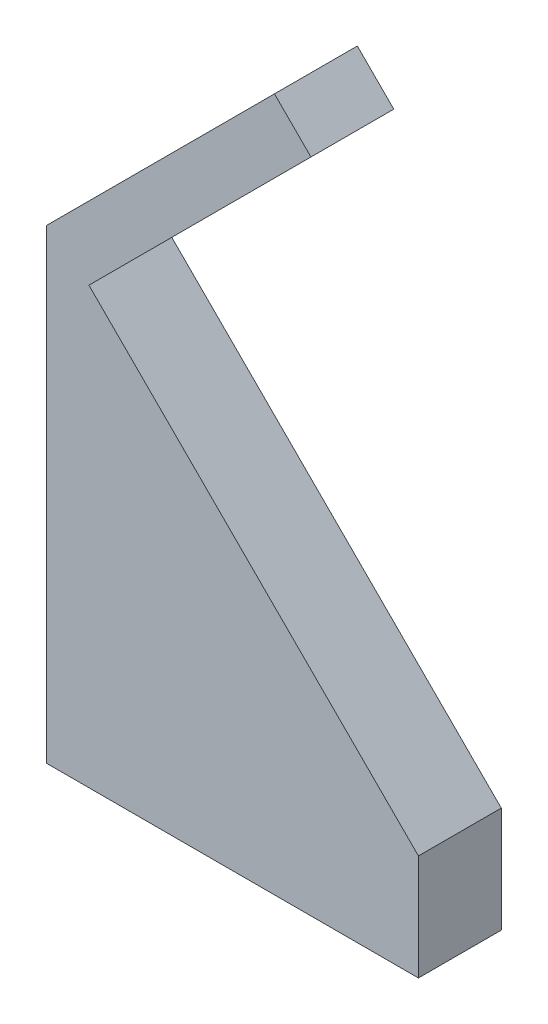
ISO-10303-21;
HEADER;
FILE_DESCRIPTION(('STEP AP214'),'2;1');
FILE_NAME('part.step','',(''),(''),'','','');
FILE_SCHEMA(('AUTOMOTIVE_DESIGN { 1 0 10303 214 1 1 1 1 }'));
ENDSEC;
DATA;
#1=APPLICATION_CONTEXT('core data for automotive mechanical design processes');
#2=APPLICATION_PROTOCOL_DEFINITION('international standard','automotive_design',2000,#1);
#3=PRODUCT_CONTEXT('',#1,'mechanical');
#4=PRODUCT('Part','Part','',(#3));
#5=PRODUCT_RELATED_PRODUCT_CATEGORY('part','',(#4));
#6=PRODUCT_DEFINITION_FORMATION('','',#4);
#7=PRODUCT_DEFINITION_CONTEXT('part definition',#1,'design');
#8=PRODUCT_DEFINITION('design','',#6,#7);
#9=PRODUCT_DEFINITION_SHAPE('','',#8);
#10=(LENGTH_UNIT() NAMED_UNIT(*) SI_UNIT(.MILLI.,.METRE.));
#11=(NAMED_UNIT(*) PLANE_ANGLE_UNIT() SI_UNIT($,.RADIAN.));
#12=(NAMED_UNIT(*) SI_UNIT($,.STERADIAN.) SOLID_ANGLE_UNIT());
#13=UNCERTAINTY_MEASURE_WITH_UNIT(LENGTH_MEASURE(1.E-05),#10,'distance_accuracy_value','');
#14=(GEOMETRIC_REPRESENTATION_CONTEXT(3) GLOBAL_UNCERTAINTY_ASSIGNED_CONTEXT((#13)) GLOBAL_UNIT_ASSIGNED_CONTEXT((#10,
#11,#12)) REPRESENTATION_CONTEXT('',''));
#15=CARTESIAN_POINT('',(0.,0.,0.));
#16=DIRECTION('',(0.,0.,1.));
#17=DIRECTION('',(1.,0.,0.));
#18=AXIS2_PLACEMENT_3D('',#15,#16,#17);
#19=CARTESIAN_POINT('',(-40.8946983434708,-5.00136204208354,8.));
#20=DIRECTION('',(1.,0.,0.));
#21=DIRECTION('',(0.,1.,0.));
#22=AXIS2_PLACEMENT_3D('',#19,#20,#21);
#23=PLANE('',#22);
#24=DIRECTION('',(0.,-1.,0.));
#25=VECTOR('',#24,1.);
#26=CARTESIAN_POINT('',(-40.8946983434708,-5.00136204208354,0.));
#27=LINE('',#26,#25);
#28=CARTESIAN_POINT('',(-40.8946983434708,-5.00136204208354,0.));
#29=VERTEX_POINT('',#28);
#30=CARTESIAN_POINT('',(-40.8946983434707,-50.,0.));
#31=VERTEX_POINT('',#30);
#32=EDGE_CURVE('E123',#29,#31,#27,.T.);
#33=ORIENTED_EDGE('',*,*,#32,.T.);
#34=DIRECTION('',(0.,0.,-1.));
#35=VECTOR('',#34,1.);
#36=CARTESIAN_POINT('',(-40.8946983434707,-50.,8.));
#37=LINE('',#36,#35);
#38=CARTESIAN_POINT('',(-40.8946983434707,-50.,8.));
#39=VERTEX_POINT('',#38);
#40=EDGE_CURVE('E11',#39,#31,#37,.T.);
#41=ORIENTED_EDGE('',*,*,#40,.F.);
#42=DIRECTION('',(0.,-1.,0.));
#43=VECTOR('',#42,1.);
#44=CARTESIAN_POINT('',(-40.8946983434708,-5.00136204208354,8.));
#45=LINE('',#44,#43);
#46=CARTESIAN_POINT('',(-40.8946983434708,-5.00136204208354,8.));
#47=VERTEX_POINT('',#46);
#48=EDGE_CURVE('E135',#47,#39,#45,.T.);
#49=ORIENTED_EDGE('',*,*,#48,.F.);
#50=DIRECTION('',(0.,0.,-1.));
#51=VECTOR('',#50,1.);
#52=CARTESIAN_POINT('',(-40.8946983434708,-5.00136204208354,8.));
#53=LINE('',#52,#51);
#54=EDGE_CURVE('E119',#47,#29,#53,.T.);
#55=ORIENTED_EDGE('',*,*,#54,.T.);
#56=EDGE_LOOP('',(#33,#41,#49,#55));
#57=FACE_BOUND('',#56,.T.);
#58=ADVANCED_FACE('F33',(#57),#23,.F.);
#59=CARTESIAN_POINT('',(-4.99999999999956,-50.,8.));
#60=DIRECTION('',(0.,1.,0.));
#61=DIRECTION('',(-1.,0.,0.));
#62=AXIS2_PLACEMENT_3D('',#59,#60,#61);
#63=PLANE('',#62);
#64=DIRECTION('',(1.,0.,0.));
#65=VECTOR('',#64,1.);
#66=CARTESIAN_POINT('',(-4.99999999999956,-50.,0.));
#67=LINE('',#66,#65);
#68=CARTESIAN_POINT('',(-4.99999999999956,-50.,0.));
#69=VERTEX_POINT('',#68);
#70=EDGE_CURVE('E126',#31,#69,#67,.T.);
#71=ORIENTED_EDGE('',*,*,#70,.T.);
#72=DIRECTION('',(0.,0.,-1.));
#73=VECTOR('',#72,1.);
#74=CARTESIAN_POINT('',(-4.99999999999956,-50.,8.));
#75=LINE('',#74,#73);
#76=CARTESIAN_POINT('',(-4.99999999999956,-50.,8.));
#77=VERTEX_POINT('',#76);
#78=EDGE_CURVE('E41',#77,#69,#75,.T.);
#79=ORIENTED_EDGE('',*,*,#78,.F.);
#80=DIRECTION('',(1.,0.,0.));
#81=VECTOR('',#80,1.);
#82=CARTESIAN_POINT('',(-4.99999999999956,-50.,8.));
#83=LINE('',#82,#81);
#84=EDGE_CURVE('E89',#39,#77,#83,.T.);
#85=ORIENTED_EDGE('',*,*,#84,.F.);
#86=ORIENTED_EDGE('',*,*,#40,.T.);
#87=EDGE_LOOP('',(#71,#79,#85,#86));
#88=FACE_BOUND('',#87,.T.);
#89=ADVANCED_FACE('F160',(#88),#63,.F.);
#90=CARTESIAN_POINT('',(-4.99999999999999,-39.7901994577491,8.));
#91=DIRECTION('',(-1.,0.,0.));
#92=DIRECTION('',(0.,-1.,0.));
#93=AXIS2_PLACEMENT_3D('',#90,#91,#92);
#94=PLANE('',#93);
#95=DIRECTION('',(0.,1.,0.));
#96=VECTOR('',#95,1.);
#97=CARTESIAN_POINT('',(-4.99999999999999,-39.7901994577491,0.));
#98=LINE('',#97,#96);
#99=CARTESIAN_POINT('',(-4.99999999999999,-39.7901994577491,0.));
#100=VERTEX_POINT('',#99);
#101=EDGE_CURVE('E128',#69,#100,#98,.T.);
#102=ORIENTED_EDGE('',*,*,#101,.T.);
#103=DIRECTION('',(0.,0.,-1.));
#104=VECTOR('',#103,1.);
#105=CARTESIAN_POINT('',(-4.99999999999999,-39.7901994577491,8.));
#106=LINE('',#105,#104);
#107=CARTESIAN_POINT('',(-4.99999999999999,-39.7901994577491,8.));
#108=VERTEX_POINT('',#107);
#109=EDGE_CURVE('E139',#108,#100,#106,.T.);
#110=ORIENTED_EDGE('',*,*,#109,.F.);
#111=DIRECTION('',(0.,1.,0.));
#112=VECTOR('',#111,1.);
#113=CARTESIAN_POINT('',(-4.99999999999999,-39.7901994577491,8.));
#114=LINE('',#113,#112);
#115=EDGE_CURVE('E147',#77,#108,#114,.T.);
#116=ORIENTED_EDGE('',*,*,#115,.F.);
#117=ORIENTED_EDGE('',*,*,#78,.T.);
#118=EDGE_LOOP('',(#102,#110,#116,#117));
#119=FACE_BOUND('',#118,.T.);
#120=ADVANCED_FACE('F145',(#119),#94,.F.);
#121=CARTESIAN_POINT('',(-4.99999999999999,-39.7901994577491,8.));
#122=DIRECTION('',(-0.707106781186552,-0.707106781186543,0.));
#123=DIRECTION('',(0.707106781186543,-0.707106781186552,0.));
#124=AXIS2_PLACEMENT_3D('',#121,#122,#123);
#125=PLANE('',#124);
#126=DIRECTION('',(-0.707106781186542,0.707106781186552,0.));
#127=VECTOR('',#126,1.);
#128=CARTESIAN_POINT('',(-4.99999999999999,-39.7901994577491,0.));
#129=LINE('',#128,#127);
#130=CARTESIAN_POINT('',(-36.8198051533944,-7.97039430435419,0.));
#131=VERTEX_POINT('',#130);
#132=EDGE_CURVE('E130',#100,#131,#129,.T.);
#133=ORIENTED_EDGE('',*,*,#132,.T.);
#134=DIRECTION('',(0.,0.,-1.));
#135=VECTOR('',#134,1.);
#136=CARTESIAN_POINT('',(-36.8198051533944,-7.97039430435419,8.));
#137=LINE('',#136,#135);
#138=CARTESIAN_POINT('',(-36.8198051533944,-7.97039430435419,8.));
#139=VERTEX_POINT('',#138);
#140=EDGE_CURVE('E114',#139,#131,#137,.T.);
#141=ORIENTED_EDGE('',*,*,#140,.F.);
#142=DIRECTION('',(-0.707106781186542,0.707106781186552,0.));
#143=VECTOR('',#142,1.);
#144=CARTESIAN_POINT('',(-4.99999999999999,-39.7901994577491,8.));
#145=LINE('',#144,#143);
#146=EDGE_CURVE('E105',#108,#139,#145,.T.);
#147=ORIENTED_EDGE('',*,*,#146,.F.);
#148=ORIENTED_EDGE('',*,*,#109,.T.);
#149=EDGE_LOOP('',(#133,#141,#147,#148));
#150=FACE_BOUND('',#149,.T.);
#151=ADVANCED_FACE('F153',(#150),#125,.F.);
#152=CARTESIAN_POINT('',(-36.8198051533944,-7.97039430435419,8.));
#153=DIRECTION('',(-0.707106781186543,0.707106781186553,0.));
#154=DIRECTION('',(-0.707106781186553,-0.707106781186542,0.));
#155=AXIS2_PLACEMENT_3D('',#152,#153,#154);
#156=PLANE('',#155);
#157=DIRECTION('',(0.707106781186552,0.707106781186542,0.));
#158=VECTOR('',#157,1.);
#159=CARTESIAN_POINT('',(-36.8198051533944,-7.97039430435419,0.));
#160=LINE('',#159,#158);
#161=CARTESIAN_POINT('',(-15.3793160616113,13.4700947874286,0.));
#162=VERTEX_POINT('',#161);
#163=EDGE_CURVE('E113',#131,#162,#160,.T.);
#164=ORIENTED_EDGE('',*,*,#163,.T.);
#165=DIRECTION('',(0.,0.,-1.));
#166=VECTOR('',#165,1.);
#167=CARTESIAN_POINT('',(-15.3793160616113,13.4700947874286,8.));
#168=LINE('',#167,#166);
#169=CARTESIAN_POINT('',(-15.3793160616113,13.4700947874286,8.));
#170=VERTEX_POINT('',#169);
#171=EDGE_CURVE('E110',#170,#162,#168,.T.);
#172=ORIENTED_EDGE('',*,*,#171,.F.);
#173=DIRECTION('',(0.707106781186552,0.707106781186542,0.));
#174=VECTOR('',#173,1.);
#175=CARTESIAN_POINT('',(-36.8198051533944,-7.97039430435419,8.));
#176=LINE('',#175,#174);
#177=EDGE_CURVE('E99',#139,#170,#176,.T.);
#178=ORIENTED_EDGE('',*,*,#177,.F.);
#179=ORIENTED_EDGE('',*,*,#140,.T.);
#180=EDGE_LOOP('',(#164,#172,#178,#179));
#181=FACE_BOUND('',#180,.T.);
#182=ADVANCED_FACE('F111',(#181),#156,.F.);
#183=CARTESIAN_POINT('',(-15.3793160616113,13.4700947874286,8.));
#184=DIRECTION('',(-0.707106781186552,-0.707106781186543,0.));
#185=DIRECTION('',(0.707106781186543,-0.707106781186552,0.));
#186=AXIS2_PLACEMENT_3D('',#183,#184,#185);
#187=PLANE('',#186);
#188=DIRECTION('',(-0.707106781186543,0.707106781186552,0.));
#189=VECTOR('',#188,1.);
#190=CARTESIAN_POINT('',(-15.3793160616113,13.4700947874286,0.));
#191=LINE('',#190,#189);
#192=CARTESIAN_POINT('',(-18.9012787877849,16.9920575136021,0.));
#193=VERTEX_POINT('',#192);
#194=EDGE_CURVE('E75',#162,#193,#191,.T.);
#195=ORIENTED_EDGE('',*,*,#194,.T.);
#196=DIRECTION('',(0.,0.,-1.));
#197=VECTOR('',#196,1.);
#198=CARTESIAN_POINT('',(-18.9012787877849,16.9920575136021,8.));
#199=LINE('',#198,#197);
#200=CARTESIAN_POINT('',(-18.9012787877849,16.9920575136021,8.));
#201=VERTEX_POINT('',#200);
#202=EDGE_CURVE('E115',#201,#193,#199,.T.);
#203=ORIENTED_EDGE('',*,*,#202,.F.);
#204=DIRECTION('',(-0.707106781186543,0.707106781186552,0.));
#205=VECTOR('',#204,1.);
#206=CARTESIAN_POINT('',(-15.3793160616113,13.4700947874286,8.));
#207=LINE('',#206,#205);
#208=EDGE_CURVE('E103',#170,#201,#207,.T.);
#209=ORIENTED_EDGE('',*,*,#208,.F.);
#210=ORIENTED_EDGE('',*,*,#171,.T.);
#211=EDGE_LOOP('',(#195,#203,#209,#210));
#212=FACE_BOUND('',#211,.T.);
#213=ADVANCED_FACE('F117',(#212),#187,.F.);
#214=CARTESIAN_POINT('',(-18.9012787877849,16.9920575136021,8.));
#215=DIRECTION('',(0.707106781186543,-0.707106781186552,0.));
#216=DIRECTION('',(0.707106781186552,0.707106781186543,0.));
#217=AXIS2_PLACEMENT_3D('',#214,#215,#216);
#218=PLANE('',#217);
#219=DIRECTION('',(-0.707106781186552,-0.707106781186543,0.));
#220=VECTOR('',#219,1.);
#221=CARTESIAN_POINT('',(-18.9012787877849,16.9920575136021,0.));
#222=LINE('',#221,#220);
#223=EDGE_CURVE('E81',#193,#29,#222,.T.);
#224=ORIENTED_EDGE('',*,*,#223,.T.);
#225=ORIENTED_EDGE('',*,*,#54,.F.);
#226=DIRECTION('',(-0.707106781186552,-0.707106781186543,0.));
#227=VECTOR('',#226,1.);
#228=CARTESIAN_POINT('',(-18.9012787877849,16.9920575136021,8.));
#229=LINE('',#228,#227);
#230=EDGE_CURVE('E49',#201,#47,#229,.T.);
#231=ORIENTED_EDGE('',*,*,#230,.F.);
#232=ORIENTED_EDGE('',*,*,#202,.T.);
#233=EDGE_LOOP('',(#224,#225,#231,#232));
#234=FACE_BOUND('',#233,.T.);
#235=ADVANCED_FACE('F174',(#234),#218,.F.);
#236=CARTESIAN_POINT('',(0.,0.,8.));
#237=DIRECTION('',(0.,0.,-1.));
#238=DIRECTION('',(-1.,0.,0.));
#239=AXIS2_PLACEMENT_3D('',#236,#237,#238);
#240=PLANE('',#239);
#241=ORIENTED_EDGE('',*,*,#48,.T.);
#242=ORIENTED_EDGE('',*,*,#84,.T.);
#243=ORIENTED_EDGE('',*,*,#115,.T.);
#244=ORIENTED_EDGE('',*,*,#146,.T.);
#245=ORIENTED_EDGE('',*,*,#177,.T.);
#246=ORIENTED_EDGE('',*,*,#208,.T.);
#247=ORIENTED_EDGE('',*,*,#230,.T.);
#248=EDGE_LOOP('',(#241,#242,#243,#244,#245,#246,#247));
#249=FACE_BOUND('',#248,.T.);
#250=ADVANCED_FACE('F101',(#249),#240,.F.);
#251=CARTESIAN_POINT('',(0.,0.,0.));
#252=DIRECTION('',(0.,0.,-1.));
#253=DIRECTION('',(-1.,0.,0.));
#254=AXIS2_PLACEMENT_3D('',#251,#252,#253);
#255=PLANE('',#254);
#256=ORIENTED_EDGE('',*,*,#32,.F.);
#257=ORIENTED_EDGE('',*,*,#223,.F.);
#258=ORIENTED_EDGE('',*,*,#194,.F.);
#259=ORIENTED_EDGE('',*,*,#163,.F.);
#260=ORIENTED_EDGE('',*,*,#132,.F.);
#261=ORIENTED_EDGE('',*,*,#101,.F.);
#262=ORIENTED_EDGE('',*,*,#70,.F.);
#263=EDGE_LOOP('',(#256,#257,#258,#259,#260,#261,#262));
#264=FACE_BOUND('',#263,.T.);
#265=ADVANCED_FACE('F151',(#264),#255,.T.);
#266=CLOSED_SHELL('',(#58,#89,#120,#151,#182,#213,#235,#250,#265));
#267=MANIFOLD_SOLID_BREP('B2',#266);
#268=ADVANCED_BREP_SHAPE_REPRESENTATION('',(#18,#267),#14);
#269=SHAPE_DEFINITION_REPRESENTATION(#9,#268);
ENDSEC;
END-ISO-10303-21;
